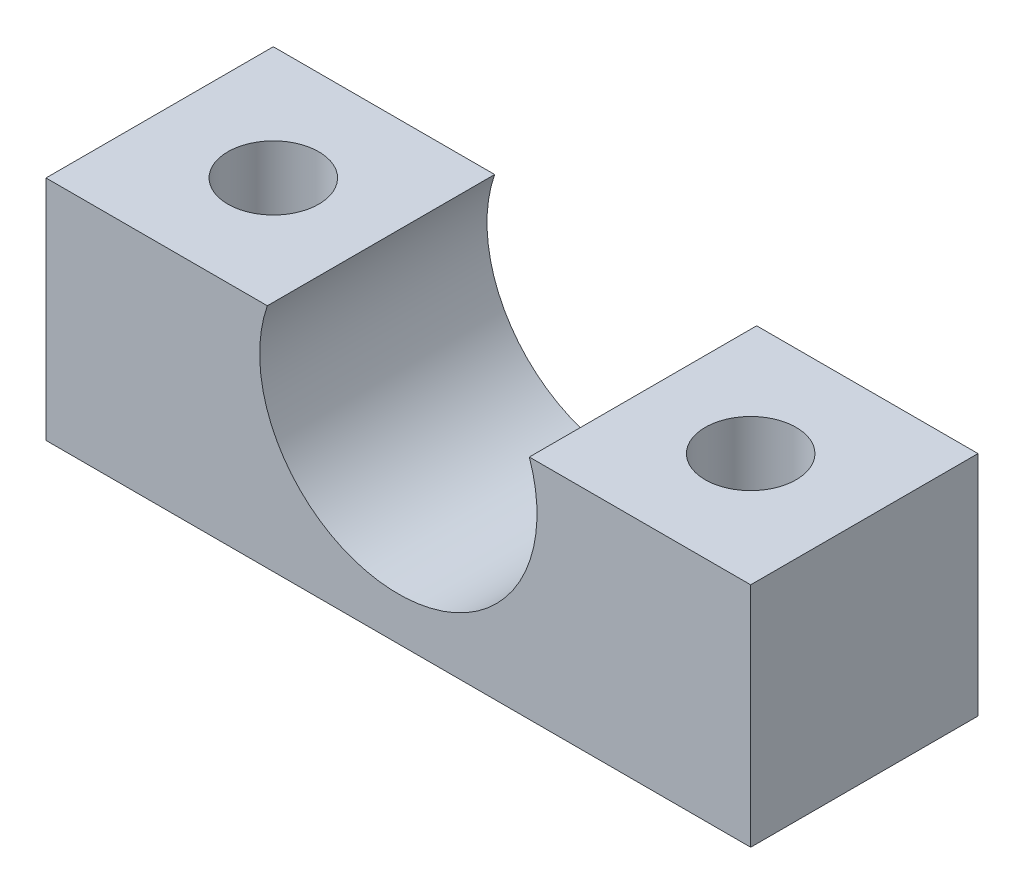
ISO-10303-21;
HEADER;
FILE_DESCRIPTION(('STEP AP214'),'2;1');
FILE_NAME('part.step','',(''),(''),'','','');
FILE_SCHEMA(('AUTOMOTIVE_DESIGN { 1 0 10303 214 1 1 1 1 }'));
ENDSEC;
DATA;
#1=APPLICATION_CONTEXT('core data for automotive mechanical design processes');
#2=APPLICATION_PROTOCOL_DEFINITION('international standard','automotive_design',2000,#1);
#3=PRODUCT_CONTEXT('',#1,'mechanical');
#4=PRODUCT('Part','Part','',(#3));
#5=PRODUCT_RELATED_PRODUCT_CATEGORY('part','',(#4));
#6=PRODUCT_DEFINITION_FORMATION('','',#4);
#7=PRODUCT_DEFINITION_CONTEXT('part definition',#1,'design');
#8=PRODUCT_DEFINITION('design','',#6,#7);
#9=PRODUCT_DEFINITION_SHAPE('','',#8);
#10=(LENGTH_UNIT() NAMED_UNIT(*) SI_UNIT(.MILLI.,.METRE.));
#11=(NAMED_UNIT(*) PLANE_ANGLE_UNIT() SI_UNIT($,.RADIAN.));
#12=(NAMED_UNIT(*) SI_UNIT($,.STERADIAN.) SOLID_ANGLE_UNIT());
#13=UNCERTAINTY_MEASURE_WITH_UNIT(LENGTH_MEASURE(1.E-05),#10,'distance_accuracy_value','');
#14=(GEOMETRIC_REPRESENTATION_CONTEXT(3) GLOBAL_UNCERTAINTY_ASSIGNED_CONTEXT((#13)) GLOBAL_UNIT_ASSIGNED_CONTEXT((#10,
#11,#12)) REPRESENTATION_CONTEXT('',''));
#15=CARTESIAN_POINT('',(0.,0.,0.));
#16=DIRECTION('',(0.,0.,1.));
#17=DIRECTION('',(1.,0.,0.));
#18=AXIS2_PLACEMENT_3D('',#15,#16,#17);
#19=CARTESIAN_POINT('',(0.,0.,10.));
#20=DIRECTION('',(0.,0.,1.));
#21=DIRECTION('',(1.,0.,0.));
#22=AXIS2_PLACEMENT_3D('',#19,#20,#21);
#23=PLANE('',#22);
#24=DIRECTION('',(-1.,0.,0.));
#25=VECTOR('',#24,1.);
#26=CARTESIAN_POINT('',(-15.3242534559657,-8.,10.));
#27=LINE('',#26,#25);
#28=CARTESIAN_POINT('',(15.5,-8.,10.));
#29=VERTEX_POINT('',#28);
#30=CARTESIAN_POINT('',(-15.5,-8.,10.));
#31=VERTEX_POINT('',#30);
#32=EDGE_CURVE('E112',#29,#31,#27,.T.);
#33=ORIENTED_EDGE('',*,*,#32,.F.);
#34=DIRECTION('',(0.,-1.,0.));
#35=VECTOR('',#34,1.);
#36=CARTESIAN_POINT('',(15.5,0.,10.));
#37=LINE('',#36,#35);
#38=CARTESIAN_POINT('',(15.5,2.,10.));
#39=VERTEX_POINT('',#38);
#40=EDGE_CURVE('E106',#39,#29,#37,.T.);
#41=ORIENTED_EDGE('',*,*,#40,.F.);
#42=DIRECTION('',(1.,0.,0.));
#43=VECTOR('',#42,1.);
#44=CARTESIAN_POINT('',(5.76281181368956,2.,10.));
#45=LINE('',#44,#43);
#46=CARTESIAN_POINT('',(5.76281181368956,2.,10.));
#47=VERTEX_POINT('',#46);
#48=EDGE_CURVE('E91',#47,#39,#45,.T.);
#49=ORIENTED_EDGE('',*,*,#48,.F.);
#50=CARTESIAN_POINT('',(0.,0.,10.));
#51=DIRECTION('',(0.,0.,1.));
#52=DIRECTION('',(1.,0.,0.));
#53=AXIS2_PLACEMENT_3D('',#50,#51,#52);
#54=CIRCLE('',#53,6.1);
#55=CARTESIAN_POINT('',(-5.76281181368956,2.,10.));
#56=VERTEX_POINT('',#55);
#57=EDGE_CURVE('E99',#56,#47,#54,.T.);
#58=ORIENTED_EDGE('',*,*,#57,.F.);
#59=DIRECTION('',(1.,0.,0.));
#60=VECTOR('',#59,1.);
#61=CARTESIAN_POINT('',(-19.8541118207016,2.,10.));
#62=LINE('',#61,#60);
#63=CARTESIAN_POINT('',(-15.5,2.,10.));
#64=VERTEX_POINT('',#63);
#65=EDGE_CURVE('E98',#64,#56,#62,.T.);
#66=ORIENTED_EDGE('',*,*,#65,.F.);
#67=DIRECTION('',(0.,-1.,0.));
#68=VECTOR('',#67,1.);
#69=CARTESIAN_POINT('',(-15.5,0.,10.));
#70=LINE('',#69,#68);
#71=EDGE_CURVE('E121',#64,#31,#70,.T.);
#72=ORIENTED_EDGE('',*,*,#71,.T.);
#73=EDGE_LOOP('',(#33,#41,#49,#58,#66,#72));
#74=FACE_BOUND('',#73,.T.);
#75=ADVANCED_FACE('F37',(#74),#23,.T.);
#76=CARTESIAN_POINT('',(0.,0.,0.));
#77=DIRECTION('',(0.,0.,1.));
#78=DIRECTION('',(1.,0.,0.));
#79=AXIS2_PLACEMENT_3D('',#76,#77,#78);
#80=PLANE('',#79);
#81=DIRECTION('',(1.,0.,0.));
#82=VECTOR('',#81,1.);
#83=CARTESIAN_POINT('',(5.76281181368956,2.,0.));
#84=LINE('',#83,#82);
#85=CARTESIAN_POINT('',(5.76281181368956,2.,0.));
#86=VERTEX_POINT('',#85);
#87=CARTESIAN_POINT('',(15.5,2.,0.));
#88=VERTEX_POINT('',#87);
#89=EDGE_CURVE('E142',#86,#88,#84,.T.);
#90=ORIENTED_EDGE('',*,*,#89,.T.);
#91=DIRECTION('',(0.,1.,0.));
#92=VECTOR('',#91,1.);
#93=CARTESIAN_POINT('',(15.5,0.,0.));
#94=LINE('',#93,#92);
#95=CARTESIAN_POINT('',(15.5,-8.,0.));
#96=VERTEX_POINT('',#95);
#97=EDGE_CURVE('E108',#96,#88,#94,.T.);
#98=ORIENTED_EDGE('',*,*,#97,.F.);
#99=DIRECTION('',(-1.,0.,0.));
#100=VECTOR('',#99,1.);
#101=CARTESIAN_POINT('',(-15.3242534559657,-8.,0.));
#102=LINE('',#101,#100);
#103=CARTESIAN_POINT('',(-15.5,-8.,0.));
#104=VERTEX_POINT('',#103);
#105=EDGE_CURVE('E127',#96,#104,#102,.T.);
#106=ORIENTED_EDGE('',*,*,#105,.T.);
#107=DIRECTION('',(0.,1.,0.));
#108=VECTOR('',#107,1.);
#109=CARTESIAN_POINT('',(-15.5,0.,0.));
#110=LINE('',#109,#108);
#111=CARTESIAN_POINT('',(-15.5,2.,0.));
#112=VERTEX_POINT('',#111);
#113=EDGE_CURVE('E118',#104,#112,#110,.T.);
#114=ORIENTED_EDGE('',*,*,#113,.T.);
#115=DIRECTION('',(1.,0.,0.));
#116=VECTOR('',#115,1.);
#117=CARTESIAN_POINT('',(0.,2.,0.));
#118=LINE('',#117,#116);
#119=CARTESIAN_POINT('',(-5.76281181368956,2.,0.));
#120=VERTEX_POINT('',#119);
#121=EDGE_CURVE('E11',#112,#120,#118,.T.);
#122=ORIENTED_EDGE('',*,*,#121,.T.);
#123=CARTESIAN_POINT('',(0.,0.,0.));
#124=DIRECTION('',(0.,0.,1.));
#125=DIRECTION('',(1.,0.,0.));
#126=AXIS2_PLACEMENT_3D('',#123,#124,#125);
#127=CIRCLE('',#126,6.1);
#128=EDGE_CURVE('E139',#120,#86,#127,.T.);
#129=ORIENTED_EDGE('',*,*,#128,.T.);
#130=EDGE_LOOP('',(#90,#98,#106,#114,#122,#129));
#131=FACE_BOUND('',#130,.T.);
#132=ADVANCED_FACE('F39',(#131),#80,.F.);
#133=CARTESIAN_POINT('',(-19.8541118207016,2.,0.));
#134=DIRECTION('',(0.,-1.,0.));
#135=DIRECTION('',(0.,0.,-1.));
#136=AXIS2_PLACEMENT_3D('',#133,#134,#135);
#137=PLANE('',#136);
#138=CARTESIAN_POINT('',(-10.5,2.,5.));
#139=DIRECTION('',(0.,1.,0.));
#140=DIRECTION('',(0.,0.,1.));
#141=AXIS2_PLACEMENT_3D('',#138,#139,#140);
#142=CIRCLE('',#141,2.);
#143=CARTESIAN_POINT('',(-10.5,2.,7.));
#144=VERTEX_POINT('',#143);
#145=EDGE_CURVE('E136',#144,#144,#142,.T.);
#146=ORIENTED_EDGE('',*,*,#145,.F.);
#147=EDGE_LOOP('',(#146));
#148=FACE_BOUND('',#147,.T.);
#149=ORIENTED_EDGE('',*,*,#65,.T.);
#150=DIRECTION('',(0.,0.,1.));
#151=VECTOR('',#150,1.);
#152=CARTESIAN_POINT('',(-5.76281181368956,2.,0.));
#153=LINE('',#152,#151);
#154=EDGE_CURVE('E47',#120,#56,#153,.T.);
#155=ORIENTED_EDGE('',*,*,#154,.F.);
#156=ORIENTED_EDGE('',*,*,#121,.F.);
#157=DIRECTION('',(0.,0.,1.));
#158=VECTOR('',#157,1.);
#159=CARTESIAN_POINT('',(-15.5,2.,-10.3876896491022));
#160=LINE('',#159,#158);
#161=EDGE_CURVE('E120',#112,#64,#160,.T.);
#162=ORIENTED_EDGE('',*,*,#161,.T.);
#163=EDGE_LOOP('',(#149,#155,#156,#162));
#164=FACE_BOUND('',#163,.T.);
#165=ADVANCED_FACE('F151',(#148,#164),#137,.F.);
#166=CARTESIAN_POINT('',(5.76281181368956,2.,0.));
#167=DIRECTION('',(0.,-1.,0.));
#168=DIRECTION('',(0.,0.,-1.));
#169=AXIS2_PLACEMENT_3D('',#166,#167,#168);
#170=PLANE('',#169);
#171=CARTESIAN_POINT('',(10.5,2.,5.));
#172=DIRECTION('',(0.,1.,0.));
#173=DIRECTION('',(0.,0.,1.));
#174=AXIS2_PLACEMENT_3D('',#171,#172,#173);
#175=CIRCLE('',#174,2.);
#176=CARTESIAN_POINT('',(10.5,2.,7.));
#177=VERTEX_POINT('',#176);
#178=EDGE_CURVE('E133',#177,#177,#175,.T.);
#179=ORIENTED_EDGE('',*,*,#178,.F.);
#180=EDGE_LOOP('',(#179));
#181=FACE_BOUND('',#180,.T.);
#182=ORIENTED_EDGE('',*,*,#89,.F.);
#183=DIRECTION('',(0.,0.,1.));
#184=VECTOR('',#183,1.);
#185=CARTESIAN_POINT('',(5.76281181368956,2.,0.));
#186=LINE('',#185,#184);
#187=EDGE_CURVE('E65',#86,#47,#186,.T.);
#188=ORIENTED_EDGE('',*,*,#187,.T.);
#189=ORIENTED_EDGE('',*,*,#48,.T.);
#190=DIRECTION('',(0.,0.,1.));
#191=VECTOR('',#190,1.);
#192=CARTESIAN_POINT('',(15.5,2.,-10.3876896491022));
#193=LINE('',#192,#191);
#194=EDGE_CURVE('E94',#88,#39,#193,.T.);
#195=ORIENTED_EDGE('',*,*,#194,.F.);
#196=EDGE_LOOP('',(#182,#188,#189,#195));
#197=FACE_BOUND('',#196,.T.);
#198=ADVANCED_FACE('F93',(#181,#197),#170,.F.);
#199=CARTESIAN_POINT('',(0.,0.,0.));
#200=DIRECTION('',(0.,0.,1.));
#201=DIRECTION('',(1.,0.,0.));
#202=AXIS2_PLACEMENT_3D('',#199,#200,#201);
#203=CYLINDRICAL_SURFACE('',#202,6.1);
#204=ORIENTED_EDGE('',*,*,#57,.T.);
#205=ORIENTED_EDGE('',*,*,#187,.F.);
#206=ORIENTED_EDGE('',*,*,#128,.F.);
#207=ORIENTED_EDGE('',*,*,#154,.T.);
#208=EDGE_LOOP('',(#204,#205,#206,#207));
#209=FACE_BOUND('',#208,.T.);
#210=ADVANCED_FACE('F148',(#209),#203,.F.);
#211=CARTESIAN_POINT('',(-10.5,-15.,5.));
#212=DIRECTION('',(0.,1.,0.));
#213=DIRECTION('',(0.,0.,1.));
#214=AXIS2_PLACEMENT_3D('',#211,#212,#213);
#215=CYLINDRICAL_SURFACE('',#214,2.);
#216=CARTESIAN_POINT('',(-10.5,-8.,5.));
#217=DIRECTION('',(0.,1.,0.));
#218=DIRECTION('',(0.,0.,1.));
#219=AXIS2_PLACEMENT_3D('',#216,#217,#218);
#220=CIRCLE('',#219,2.);
#221=CARTESIAN_POINT('',(-10.5,-8.,7.));
#222=VERTEX_POINT('',#221);
#223=EDGE_CURVE('E130',#222,#222,#220,.F.);
#224=ORIENTED_EDGE('',*,*,#223,.T.);
#225=EDGE_LOOP('',(#224));
#226=FACE_BOUND('',#225,.T.);
#227=ORIENTED_EDGE('',*,*,#145,.T.);
#228=EDGE_LOOP('',(#227));
#229=FACE_BOUND('',#228,.T.);
#230=ADVANCED_FACE('F171',(#226,#229),#215,.F.);
#231=CARTESIAN_POINT('',(10.5,-15.,5.));
#232=DIRECTION('',(0.,1.,0.));
#233=DIRECTION('',(0.,0.,1.));
#234=AXIS2_PLACEMENT_3D('',#231,#232,#233);
#235=CYLINDRICAL_SURFACE('',#234,2.);
#236=CARTESIAN_POINT('',(10.5,-8.,5.));
#237=DIRECTION('',(0.,1.,0.));
#238=DIRECTION('',(0.,0.,1.));
#239=AXIS2_PLACEMENT_3D('',#236,#237,#238);
#240=CIRCLE('',#239,2.);
#241=CARTESIAN_POINT('',(10.5,-8.,7.));
#242=VERTEX_POINT('',#241);
#243=EDGE_CURVE('E41',#242,#242,#240,.F.);
#244=ORIENTED_EDGE('',*,*,#243,.T.);
#245=EDGE_LOOP('',(#244));
#246=FACE_BOUND('',#245,.T.);
#247=ORIENTED_EDGE('',*,*,#178,.T.);
#248=EDGE_LOOP('',(#247));
#249=FACE_BOUND('',#248,.T.);
#250=ADVANCED_FACE('F177',(#246,#249),#235,.F.);
#251=CARTESIAN_POINT('',(-15.3242534559657,-8.,0.));
#252=DIRECTION('',(0.,1.,0.));
#253=DIRECTION('',(0.,0.,1.));
#254=AXIS2_PLACEMENT_3D('',#251,#252,#253);
#255=PLANE('',#254);
#256=ORIENTED_EDGE('',*,*,#243,.F.);
#257=EDGE_LOOP('',(#256));
#258=FACE_BOUND('',#257,.T.);
#259=ORIENTED_EDGE('',*,*,#223,.F.);
#260=EDGE_LOOP('',(#259));
#261=FACE_BOUND('',#260,.T.);
#262=ORIENTED_EDGE('',*,*,#32,.T.);
#263=DIRECTION('',(0.,0.,1.));
#264=VECTOR('',#263,1.);
#265=CARTESIAN_POINT('',(-15.5,-8.,-10.3876896491022));
#266=LINE('',#265,#264);
#267=EDGE_CURVE('E123',#104,#31,#266,.T.);
#268=ORIENTED_EDGE('',*,*,#267,.F.);
#269=ORIENTED_EDGE('',*,*,#105,.F.);
#270=DIRECTION('',(0.,0.,1.));
#271=VECTOR('',#270,1.);
#272=CARTESIAN_POINT('',(15.5,-8.,-10.3876896491022));
#273=LINE('',#272,#271);
#274=EDGE_CURVE('E109',#96,#29,#273,.T.);
#275=ORIENTED_EDGE('',*,*,#274,.T.);
#276=EDGE_LOOP('',(#262,#268,#269,#275));
#277=FACE_BOUND('',#276,.T.);
#278=ADVANCED_FACE('F157',(#258,#261,#277),#255,.F.);
#279=CARTESIAN_POINT('',(-15.5,0.,-10.3876896491022));
#280=DIRECTION('',(-1.,0.,0.));
#281=DIRECTION('',(0.,-1.,0.));
#282=AXIS2_PLACEMENT_3D('',#279,#280,#281);
#283=PLANE('',#282);
#284=ORIENTED_EDGE('',*,*,#113,.F.);
#285=ORIENTED_EDGE('',*,*,#267,.T.);
#286=ORIENTED_EDGE('',*,*,#71,.F.);
#287=ORIENTED_EDGE('',*,*,#161,.F.);
#288=EDGE_LOOP('',(#284,#285,#286,#287));
#289=FACE_BOUND('',#288,.T.);
#290=ADVANCED_FACE('F154',(#289),#283,.T.);
#291=CARTESIAN_POINT('',(15.5,0.,-10.3876896491022));
#292=DIRECTION('',(-1.,0.,0.));
#293=DIRECTION('',(0.,-1.,0.));
#294=AXIS2_PLACEMENT_3D('',#291,#292,#293);
#295=PLANE('',#294);
#296=ORIENTED_EDGE('',*,*,#274,.F.);
#297=ORIENTED_EDGE('',*,*,#97,.T.);
#298=ORIENTED_EDGE('',*,*,#194,.T.);
#299=ORIENTED_EDGE('',*,*,#40,.T.);
#300=EDGE_LOOP('',(#296,#297,#298,#299));
#301=FACE_BOUND('',#300,.T.);
#302=ADVANCED_FACE('F105',(#301),#295,.F.);
#303=CLOSED_SHELL('',(#75,#132,#165,#198,#210,#230,#250,#278,#290,#302));
#304=MANIFOLD_SOLID_BREP('B2',#303);
#305=ADVANCED_BREP_SHAPE_REPRESENTATION('',(#18,#304),#14);
#306=SHAPE_DEFINITION_REPRESENTATION(#9,#305);
ENDSEC;
END-ISO-10303-21;
